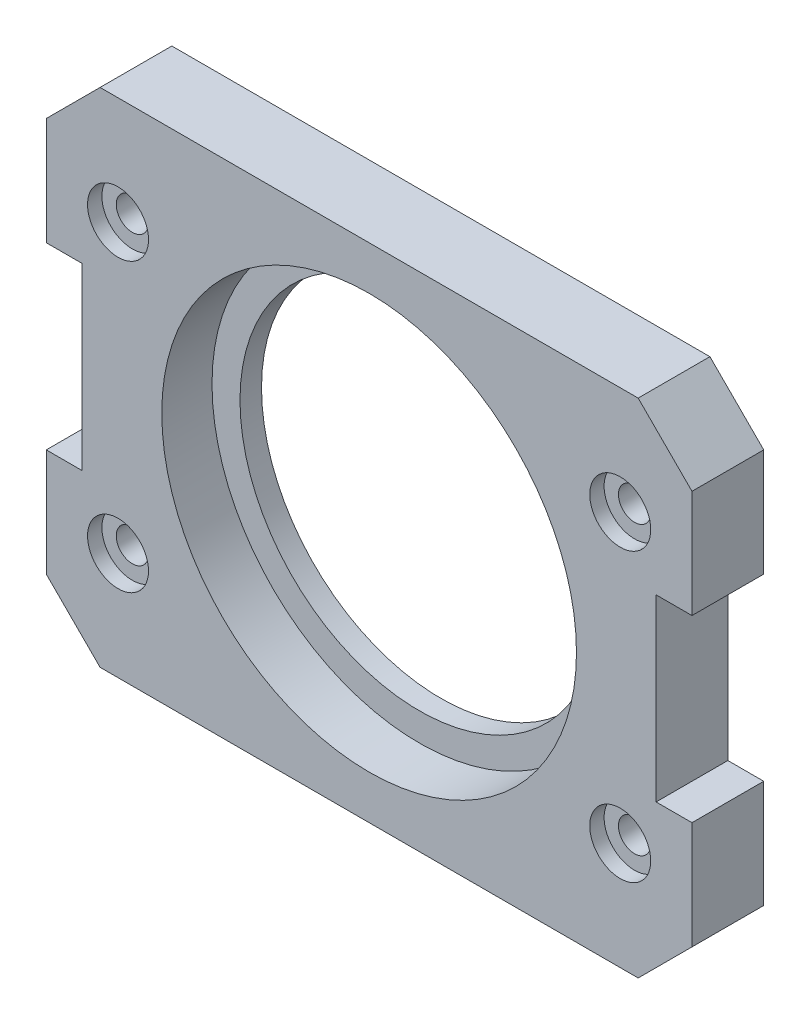
ISO-10303-21;
HEADER;
FILE_DESCRIPTION(('STEP AP214'),'2;1');
FILE_NAME('part.step','',(''),(''),'','','');
FILE_SCHEMA(('AUTOMOTIVE_DESIGN { 1 0 10303 214 1 1 1 1 }'));
ENDSEC;
DATA;
#1=APPLICATION_CONTEXT('core data for automotive mechanical design processes');
#2=APPLICATION_PROTOCOL_DEFINITION('international standard','automotive_design',2000,#1);
#3=PRODUCT_CONTEXT('',#1,'mechanical');
#4=PRODUCT('Part','Part','',(#3));
#5=PRODUCT_RELATED_PRODUCT_CATEGORY('part','',(#4));
#6=PRODUCT_DEFINITION_FORMATION('','',#4);
#7=PRODUCT_DEFINITION_CONTEXT('part definition',#1,'design');
#8=PRODUCT_DEFINITION('design','',#6,#7);
#9=PRODUCT_DEFINITION_SHAPE('','',#8);
#10=(LENGTH_UNIT() NAMED_UNIT(*) SI_UNIT(.MILLI.,.METRE.));
#11=(NAMED_UNIT(*) PLANE_ANGLE_UNIT() SI_UNIT($,.RADIAN.));
#12=(NAMED_UNIT(*) SI_UNIT($,.STERADIAN.) SOLID_ANGLE_UNIT());
#13=UNCERTAINTY_MEASURE_WITH_UNIT(LENGTH_MEASURE(1.E-05),#10,'distance_accuracy_value','');
#14=(GEOMETRIC_REPRESENTATION_CONTEXT(3) GLOBAL_UNCERTAINTY_ASSIGNED_CONTEXT((#13)) GLOBAL_UNIT_ASSIGNED_CONTEXT((#10,
#11,#12)) REPRESENTATION_CONTEXT('',''));
#15=CARTESIAN_POINT('',(0.,0.,0.));
#16=DIRECTION('',(0.,0.,1.));
#17=DIRECTION('',(1.,0.,0.));
#18=AXIS2_PLACEMENT_3D('',#15,#16,#17);
#19=CARTESIAN_POINT('',(45.,-35.,5.));
#20=DIRECTION('',(-1.,0.,0.));
#21=DIRECTION('',(0.,0.,1.));
#22=AXIS2_PLACEMENT_3D('',#19,#20,#21);
#23=PLANE('',#22);
#24=DIRECTION('',(0.,1.,0.));
#25=VECTOR('',#24,1.);
#26=CARTESIAN_POINT('',(45.,-35.,5.));
#27=LINE('',#26,#25);
#28=CARTESIAN_POINT('',(45.,-27.5,5.));
#29=VERTEX_POINT('',#28);
#30=CARTESIAN_POINT('',(45.,-12.5,5.));
#31=VERTEX_POINT('',#30);
#32=EDGE_CURVE('E269',#29,#31,#27,.T.);
#33=ORIENTED_EDGE('',*,*,#32,.F.);
#34=DIRECTION('',(0.,0.,-1.));
#35=VECTOR('',#34,1.);
#36=CARTESIAN_POINT('',(45.,-27.5,5.));
#37=LINE('',#36,#35);
#38=CARTESIAN_POINT('',(45.,-27.5,-5.));
#39=VERTEX_POINT('',#38);
#40=EDGE_CURVE('E332',#29,#39,#37,.T.);
#41=ORIENTED_EDGE('',*,*,#40,.T.);
#42=DIRECTION('',(0.,1.,0.));
#43=VECTOR('',#42,1.);
#44=CARTESIAN_POINT('',(45.,-35.,-5.));
#45=LINE('',#44,#43);
#46=CARTESIAN_POINT('',(45.,-12.5,-5.));
#47=VERTEX_POINT('',#46);
#48=EDGE_CURVE('E280',#39,#47,#45,.T.);
#49=ORIENTED_EDGE('',*,*,#48,.T.);
#50=DIRECTION('',(0.,0.,1.));
#51=VECTOR('',#50,1.);
#52=CARTESIAN_POINT('',(45.,-12.5,5.));
#53=LINE('',#52,#51);
#54=EDGE_CURVE('E307',#47,#31,#53,.T.);
#55=ORIENTED_EDGE('',*,*,#54,.T.);
#56=EDGE_LOOP('',(#33,#41,#49,#55));
#57=FACE_BOUND('',#56,.T.);
#58=ADVANCED_FACE('F43',(#57),#23,.F.);
#59=CARTESIAN_POINT('',(-45.,-35.,5.));
#60=DIRECTION('',(1.,0.,0.));
#61=DIRECTION('',(0.,0.,-1.));
#62=AXIS2_PLACEMENT_3D('',#59,#60,#61);
#63=PLANE('',#62);
#64=DIRECTION('',(0.,-1.,0.));
#65=VECTOR('',#64,1.);
#66=CARTESIAN_POINT('',(-45.,-35.,-5.));
#67=LINE('',#66,#65);
#68=CARTESIAN_POINT('',(-45.,-12.5,-5.));
#69=VERTEX_POINT('',#68);
#70=CARTESIAN_POINT('',(-45.,-27.5,-5.));
#71=VERTEX_POINT('',#70);
#72=EDGE_CURVE('E284',#69,#71,#67,.T.);
#73=ORIENTED_EDGE('',*,*,#72,.T.);
#74=DIRECTION('',(0.,0.,1.));
#75=VECTOR('',#74,1.);
#76=CARTESIAN_POINT('',(-45.,-27.5,5.));
#77=LINE('',#76,#75);
#78=CARTESIAN_POINT('',(-45.,-27.5,5.));
#79=VERTEX_POINT('',#78);
#80=EDGE_CURVE('E323',#71,#79,#77,.T.);
#81=ORIENTED_EDGE('',*,*,#80,.T.);
#82=DIRECTION('',(0.,-1.,0.));
#83=VECTOR('',#82,1.);
#84=CARTESIAN_POINT('',(-45.,-35.,5.));
#85=LINE('',#84,#83);
#86=CARTESIAN_POINT('',(-45.,-12.5,5.));
#87=VERTEX_POINT('',#86);
#88=EDGE_CURVE('E274',#87,#79,#85,.T.);
#89=ORIENTED_EDGE('',*,*,#88,.F.);
#90=DIRECTION('',(0.,0.,-1.));
#91=VECTOR('',#90,1.);
#92=CARTESIAN_POINT('',(-45.,-12.5,5.));
#93=LINE('',#92,#91);
#94=EDGE_CURVE('E301',#87,#69,#93,.T.);
#95=ORIENTED_EDGE('',*,*,#94,.T.);
#96=EDGE_LOOP('',(#73,#81,#89,#95));
#97=FACE_BOUND('',#96,.T.);
#98=ADVANCED_FACE('F366',(#97),#63,.F.);
#99=CARTESIAN_POINT('',(35.,20.,5.));
#100=DIRECTION('',(0.,0.,-1.));
#101=DIRECTION('',(-1.,0.,0.));
#102=AXIS2_PLACEMENT_3D('',#99,#100,#101);
#103=CYLINDRICAL_SURFACE('',#102,2.25);
#104=CARTESIAN_POINT('',(35.,20.,-5.));
#105=DIRECTION('',(0.,0.,1.));
#106=DIRECTION('',(1.,0.,0.));
#107=AXIS2_PLACEMENT_3D('',#104,#105,#106);
#108=CIRCLE('',#107,2.25);
#109=CARTESIAN_POINT('',(37.25,20.,-5.));
#110=VERTEX_POINT('',#109);
#111=EDGE_CURVE('E262',#110,#110,#108,.T.);
#112=ORIENTED_EDGE('',*,*,#111,.F.);
#113=EDGE_LOOP('',(#112));
#114=FACE_BOUND('',#113,.T.);
#115=CARTESIAN_POINT('',(35.,20.,3.));
#116=DIRECTION('',(0.,0.,1.));
#117=DIRECTION('',(1.,0.,0.));
#118=AXIS2_PLACEMENT_3D('',#115,#116,#117);
#119=CIRCLE('',#118,2.25);
#120=CARTESIAN_POINT('',(37.25,20.,3.));
#121=VERTEX_POINT('',#120);
#122=EDGE_CURVE('E250',#121,#121,#119,.T.);
#123=ORIENTED_EDGE('',*,*,#122,.T.);
#124=EDGE_LOOP('',(#123));
#125=FACE_BOUND('',#124,.T.);
#126=ADVANCED_FACE('F406',(#114,#125),#103,.F.);
#127=CARTESIAN_POINT('',(35.,-20.,5.));
#128=DIRECTION('',(0.,0.,-1.));
#129=DIRECTION('',(-1.,0.,0.));
#130=AXIS2_PLACEMENT_3D('',#127,#128,#129);
#131=CYLINDRICAL_SURFACE('',#130,2.25);
#132=CARTESIAN_POINT('',(35.,-20.,-5.));
#133=DIRECTION('',(0.,0.,1.));
#134=DIRECTION('',(1.,0.,0.));
#135=AXIS2_PLACEMENT_3D('',#132,#133,#134);
#136=CIRCLE('',#135,2.25);
#137=CARTESIAN_POINT('',(37.25,-20.,-5.));
#138=VERTEX_POINT('',#137);
#139=EDGE_CURVE('E259',#138,#138,#136,.T.);
#140=ORIENTED_EDGE('',*,*,#139,.F.);
#141=EDGE_LOOP('',(#140));
#142=FACE_BOUND('',#141,.T.);
#143=CARTESIAN_POINT('',(35.,-20.,3.));
#144=DIRECTION('',(0.,0.,1.));
#145=DIRECTION('',(1.,0.,0.));
#146=AXIS2_PLACEMENT_3D('',#143,#144,#145);
#147=CIRCLE('',#146,2.25);
#148=CARTESIAN_POINT('',(37.25,-20.,3.));
#149=VERTEX_POINT('',#148);
#150=EDGE_CURVE('E295',#149,#149,#147,.T.);
#151=ORIENTED_EDGE('',*,*,#150,.T.);
#152=EDGE_LOOP('',(#151));
#153=FACE_BOUND('',#152,.T.);
#154=ADVANCED_FACE('F592',(#142,#153),#131,.F.);
#155=CARTESIAN_POINT('',(-35.,-20.,5.));
#156=DIRECTION('',(0.,0.,-1.));
#157=DIRECTION('',(-1.,0.,0.));
#158=AXIS2_PLACEMENT_3D('',#155,#156,#157);
#159=CYLINDRICAL_SURFACE('',#158,2.25);
#160=CARTESIAN_POINT('',(-35.,-20.,-5.));
#161=DIRECTION('',(0.,0.,1.));
#162=DIRECTION('',(1.,0.,0.));
#163=AXIS2_PLACEMENT_3D('',#160,#161,#162);
#164=CIRCLE('',#163,2.25);
#165=CARTESIAN_POINT('',(-32.75,-20.,-5.));
#166=VERTEX_POINT('',#165);
#167=EDGE_CURVE('E256',#166,#166,#164,.T.);
#168=ORIENTED_EDGE('',*,*,#167,.F.);
#169=EDGE_LOOP('',(#168));
#170=FACE_BOUND('',#169,.T.);
#171=CARTESIAN_POINT('',(-35.,-20.,3.));
#172=DIRECTION('',(0.,0.,1.));
#173=DIRECTION('',(1.,0.,0.));
#174=AXIS2_PLACEMENT_3D('',#171,#172,#173);
#175=CIRCLE('',#174,2.25);
#176=CARTESIAN_POINT('',(-32.75,-20.,3.));
#177=VERTEX_POINT('',#176);
#178=EDGE_CURVE('E292',#177,#177,#175,.T.);
#179=ORIENTED_EDGE('',*,*,#178,.T.);
#180=EDGE_LOOP('',(#179));
#181=FACE_BOUND('',#180,.T.);
#182=ADVANCED_FACE('F603',(#170,#181),#159,.F.);
#183=CARTESIAN_POINT('',(-35.,20.,5.));
#184=DIRECTION('',(0.,0.,-1.));
#185=DIRECTION('',(-1.,0.,0.));
#186=AXIS2_PLACEMENT_3D('',#183,#184,#185);
#187=CYLINDRICAL_SURFACE('',#186,2.25);
#188=CARTESIAN_POINT('',(-35.,20.,-5.));
#189=DIRECTION('',(0.,0.,1.));
#190=DIRECTION('',(1.,0.,0.));
#191=AXIS2_PLACEMENT_3D('',#188,#189,#190);
#192=CIRCLE('',#191,2.25);
#193=CARTESIAN_POINT('',(-32.75,20.,-5.));
#194=VERTEX_POINT('',#193);
#195=EDGE_CURVE('E253',#194,#194,#192,.T.);
#196=ORIENTED_EDGE('',*,*,#195,.F.);
#197=EDGE_LOOP('',(#196));
#198=FACE_BOUND('',#197,.T.);
#199=CARTESIAN_POINT('',(-35.,20.,3.));
#200=DIRECTION('',(0.,0.,1.));
#201=DIRECTION('',(1.,0.,0.));
#202=AXIS2_PLACEMENT_3D('',#199,#200,#201);
#203=CIRCLE('',#202,2.25);
#204=CARTESIAN_POINT('',(-32.75,20.,3.));
#205=VERTEX_POINT('',#204);
#206=EDGE_CURVE('E240',#205,#205,#203,.T.);
#207=ORIENTED_EDGE('',*,*,#206,.T.);
#208=EDGE_LOOP('',(#207));
#209=FACE_BOUND('',#208,.T.);
#210=ADVANCED_FACE('F613',(#198,#209),#187,.F.);
#211=CARTESIAN_POINT('',(0.,0.,5.));
#212=DIRECTION('',(0.,0.,-1.));
#213=DIRECTION('',(-1.,0.,0.));
#214=AXIS2_PLACEMENT_3D('',#211,#212,#213);
#215=CYLINDRICAL_SURFACE('',#214,28.9);
#216=CARTESIAN_POINT('',(0.,0.,5.));
#217=DIRECTION('',(0.,0.,1.));
#218=DIRECTION('',(1.,0.,0.));
#219=AXIS2_PLACEMENT_3D('',#216,#217,#218);
#220=CIRCLE('',#219,28.9);
#221=CARTESIAN_POINT('',(28.9,0.,5.));
#222=VERTEX_POINT('',#221);
#223=EDGE_CURVE('E265',#222,#222,#220,.T.);
#224=ORIENTED_EDGE('',*,*,#223,.T.);
#225=EDGE_LOOP('',(#224));
#226=FACE_BOUND('',#225,.T.);
#227=CARTESIAN_POINT('',(0.,0.,-2.));
#228=DIRECTION('',(0.,0.,-1.));
#229=DIRECTION('',(-1.,0.,0.));
#230=AXIS2_PLACEMENT_3D('',#227,#228,#229);
#231=CIRCLE('',#230,28.9);
#232=CARTESIAN_POINT('',(-28.9,0.,-2.));
#233=VERTEX_POINT('',#232);
#234=EDGE_CURVE('E246',#233,#233,#231,.T.);
#235=ORIENTED_EDGE('',*,*,#234,.T.);
#236=EDGE_LOOP('',(#235));
#237=FACE_BOUND('',#236,.T.);
#238=ADVANCED_FACE('F419',(#226,#237),#215,.F.);
#239=CARTESIAN_POINT('',(0.,0.,5.));
#240=DIRECTION('',(0.,0.,-1.));
#241=DIRECTION('',(-1.,0.,0.));
#242=AXIS2_PLACEMENT_3D('',#239,#240,#241);
#243=PLANE('',#242);
#244=CARTESIAN_POINT('',(-35.,-20.,5.));
#245=DIRECTION('',(0.,0.,1.));
#246=DIRECTION('',(1.,0.,0.));
#247=AXIS2_PLACEMENT_3D('',#244,#245,#246);
#248=CIRCLE('',#247,4.25);
#249=CARTESIAN_POINT('',(-30.75,-20.,5.));
#250=VERTEX_POINT('',#249);
#251=EDGE_CURVE('E232',#250,#250,#248,.T.);
#252=ORIENTED_EDGE('',*,*,#251,.F.);
#253=EDGE_LOOP('',(#252));
#254=FACE_BOUND('',#253,.T.);
#255=CARTESIAN_POINT('',(35.,-20.,5.));
#256=DIRECTION('',(0.,0.,1.));
#257=DIRECTION('',(1.,0.,0.));
#258=AXIS2_PLACEMENT_3D('',#255,#256,#257);
#259=CIRCLE('',#258,4.25);
#260=CARTESIAN_POINT('',(39.25,-20.,5.));
#261=VERTEX_POINT('',#260);
#262=EDGE_CURVE('E226',#261,#261,#259,.T.);
#263=ORIENTED_EDGE('',*,*,#262,.F.);
#264=EDGE_LOOP('',(#263));
#265=FACE_BOUND('',#264,.T.);
#266=CARTESIAN_POINT('',(35.,20.,5.));
#267=DIRECTION('',(0.,0.,1.));
#268=DIRECTION('',(1.,0.,0.));
#269=AXIS2_PLACEMENT_3D('',#266,#267,#268);
#270=CIRCLE('',#269,4.25);
#271=CARTESIAN_POINT('',(39.25,20.,5.));
#272=VERTEX_POINT('',#271);
#273=EDGE_CURVE('E219',#272,#272,#270,.T.);
#274=ORIENTED_EDGE('',*,*,#273,.F.);
#275=EDGE_LOOP('',(#274));
#276=FACE_BOUND('',#275,.T.);
#277=CARTESIAN_POINT('',(-35.,20.,5.));
#278=DIRECTION('',(0.,0.,1.));
#279=DIRECTION('',(1.,0.,0.));
#280=AXIS2_PLACEMENT_3D('',#277,#278,#279);
#281=CIRCLE('',#280,4.25);
#282=CARTESIAN_POINT('',(-30.75,20.,5.));
#283=VERTEX_POINT('',#282);
#284=EDGE_CURVE('E222',#283,#283,#281,.T.);
#285=ORIENTED_EDGE('',*,*,#284,.F.);
#286=EDGE_LOOP('',(#285));
#287=FACE_BOUND('',#286,.T.);
#288=ORIENTED_EDGE('',*,*,#88,.T.);
#289=DIRECTION('',(-0.707106781186546,0.707106781186549,0.));
#290=VECTOR('',#289,1.);
#291=CARTESIAN_POINT('',(-37.5,-35.,5.));
#292=LINE('',#291,#290);
#293=CARTESIAN_POINT('',(-37.5,-35.,5.));
#294=VERTEX_POINT('',#293);
#295=EDGE_CURVE('E330',#79,#294,#292,.F.);
#296=ORIENTED_EDGE('',*,*,#295,.T.);
#297=DIRECTION('',(1.,0.,0.));
#298=VECTOR('',#297,1.);
#299=CARTESIAN_POINT('',(-45.,-35.,5.));
#300=LINE('',#299,#298);
#301=CARTESIAN_POINT('',(37.4999999999999,-35.,5.));
#302=VERTEX_POINT('',#301);
#303=EDGE_CURVE('E277',#294,#302,#300,.T.);
#304=ORIENTED_EDGE('',*,*,#303,.T.);
#305=DIRECTION('',(-0.707106781186549,-0.707106781186546,0.));
#306=VECTOR('',#305,1.);
#307=CARTESIAN_POINT('',(45.,-27.5,5.));
#308=LINE('',#307,#306);
#309=EDGE_CURVE('E328',#302,#29,#308,.F.);
#310=ORIENTED_EDGE('',*,*,#309,.T.);
#311=ORIENTED_EDGE('',*,*,#32,.T.);
#312=DIRECTION('',(1.,0.,0.));
#313=VECTOR('',#312,1.);
#314=CARTESIAN_POINT('',(50.,-12.5,5.));
#315=LINE('',#314,#313);
#316=CARTESIAN_POINT('',(40.,-12.5,5.));
#317=VERTEX_POINT('',#316);
#318=EDGE_CURVE('E204',#317,#31,#315,.T.);
#319=ORIENTED_EDGE('',*,*,#318,.F.);
#320=DIRECTION('',(0.,-1.,0.));
#321=VECTOR('',#320,1.);
#322=CARTESIAN_POINT('',(40.,-12.5,5.));
#323=LINE('',#322,#321);
#324=CARTESIAN_POINT('',(40.,12.5,5.));
#325=VERTEX_POINT('',#324);
#326=EDGE_CURVE('E207',#325,#317,#323,.T.);
#327=ORIENTED_EDGE('',*,*,#326,.F.);
#328=DIRECTION('',(-1.,0.,0.));
#329=VECTOR('',#328,1.);
#330=CARTESIAN_POINT('',(50.,12.5,5.));
#331=LINE('',#330,#329);
#332=CARTESIAN_POINT('',(45.,12.5,5.));
#333=VERTEX_POINT('',#332);
#334=EDGE_CURVE('E194',#333,#325,#331,.T.);
#335=ORIENTED_EDGE('',*,*,#334,.F.);
#336=CARTESIAN_POINT('',(45.,27.5,5.));
#337=VERTEX_POINT('',#336);
#338=EDGE_CURVE('E272',#333,#337,#27,.T.);
#339=ORIENTED_EDGE('',*,*,#338,.T.);
#340=DIRECTION('',(0.707106781186546,-0.707106781186549,0.));
#341=VECTOR('',#340,1.);
#342=CARTESIAN_POINT('',(37.5,35.,5.));
#343=LINE('',#342,#341);
#344=CARTESIAN_POINT('',(37.5,35.,5.));
#345=VERTEX_POINT('',#344);
#346=EDGE_CURVE('E326',#337,#345,#343,.F.);
#347=ORIENTED_EDGE('',*,*,#346,.T.);
#348=DIRECTION('',(-1.,0.,0.));
#349=VECTOR('',#348,1.);
#350=CARTESIAN_POINT('',(-45.,35.,5.));
#351=LINE('',#350,#349);
#352=CARTESIAN_POINT('',(-37.5,35.,5.));
#353=VERTEX_POINT('',#352);
#354=EDGE_CURVE('E271',#345,#353,#351,.T.);
#355=ORIENTED_EDGE('',*,*,#354,.T.);
#356=DIRECTION('',(0.707106781186549,0.707106781186546,0.));
#357=VECTOR('',#356,1.);
#358=CARTESIAN_POINT('',(-45.,27.5,5.));
#359=LINE('',#358,#357);
#360=CARTESIAN_POINT('',(-45.,27.5,5.));
#361=VERTEX_POINT('',#360);
#362=EDGE_CURVE('E59',#353,#361,#359,.F.);
#363=ORIENTED_EDGE('',*,*,#362,.T.);
#364=CARTESIAN_POINT('',(-45.,12.5,5.));
#365=VERTEX_POINT('',#364);
#366=EDGE_CURVE('E275',#361,#365,#85,.T.);
#367=ORIENTED_EDGE('',*,*,#366,.T.);
#368=DIRECTION('',(-1.,0.,0.));
#369=VECTOR('',#368,1.);
#370=CARTESIAN_POINT('',(-50.,12.5,5.));
#371=LINE('',#370,#369);
#372=CARTESIAN_POINT('',(-40.,12.5,5.));
#373=VERTEX_POINT('',#372);
#374=EDGE_CURVE('E189',#373,#365,#371,.T.);
#375=ORIENTED_EDGE('',*,*,#374,.F.);
#376=DIRECTION('',(0.,1.,0.));
#377=VECTOR('',#376,1.);
#378=CARTESIAN_POINT('',(-40.,-12.5,5.));
#379=LINE('',#378,#377);
#380=CARTESIAN_POINT('',(-40.,-12.5,5.));
#381=VERTEX_POINT('',#380);
#382=EDGE_CURVE('E167',#381,#373,#379,.T.);
#383=ORIENTED_EDGE('',*,*,#382,.F.);
#384=DIRECTION('',(1.,0.,0.));
#385=VECTOR('',#384,1.);
#386=CARTESIAN_POINT('',(-50.,-12.5,5.));
#387=LINE('',#386,#385);
#388=EDGE_CURVE('E187',#87,#381,#387,.T.);
#389=ORIENTED_EDGE('',*,*,#388,.F.);
#390=EDGE_LOOP('',(#288,#296,#304,#310,#311,#319,#327,#335,#339,#347,#355,#363,#367,#375,#383,#389));
#391=FACE_BOUND('',#390,.T.);
#392=ORIENTED_EDGE('',*,*,#223,.F.);
#393=EDGE_LOOP('',(#392));
#394=FACE_BOUND('',#393,.T.);
#395=ADVANCED_FACE('F349',(#254,#265,#276,#287,#391,#394),#243,.F.);
#396=CARTESIAN_POINT('',(0.,0.,-5.));
#397=DIRECTION('',(0.,0.,-1.));
#398=DIRECTION('',(-1.,0.,0.));
#399=AXIS2_PLACEMENT_3D('',#396,#397,#398);
#400=PLANE('',#399);
#401=DIRECTION('',(1.,0.,0.));
#402=VECTOR('',#401,1.);
#403=CARTESIAN_POINT('',(-45.,-35.,-5.));
#404=LINE('',#403,#402);
#405=CARTESIAN_POINT('',(-37.5,-35.,-5.));
#406=VERTEX_POINT('',#405);
#407=CARTESIAN_POINT('',(37.4999999999999,-35.,-5.));
#408=VERTEX_POINT('',#407);
#409=EDGE_CURVE('E287',#406,#408,#404,.T.);
#410=ORIENTED_EDGE('',*,*,#409,.F.);
#411=DIRECTION('',(0.707106781186546,-0.707106781186549,0.));
#412=VECTOR('',#411,1.);
#413=CARTESIAN_POINT('',(-36.2500000000001,-36.2499999999999,-5.));
#414=LINE('',#413,#412);
#415=EDGE_CURVE('E321',#406,#71,#414,.F.);
#416=ORIENTED_EDGE('',*,*,#415,.T.);
#417=ORIENTED_EDGE('',*,*,#72,.F.);
#418=DIRECTION('',(1.,0.,0.));
#419=VECTOR('',#418,1.);
#420=CARTESIAN_POINT('',(-50.,-12.5,-5.));
#421=LINE('',#420,#419);
#422=CARTESIAN_POINT('',(-40.,-12.5,-5.));
#423=VERTEX_POINT('',#422);
#424=EDGE_CURVE('E172',#69,#423,#421,.T.);
#425=ORIENTED_EDGE('',*,*,#424,.T.);
#426=DIRECTION('',(0.,1.,0.));
#427=VECTOR('',#426,1.);
#428=CARTESIAN_POINT('',(-40.,-12.5,-5.));
#429=LINE('',#428,#427);
#430=CARTESIAN_POINT('',(-40.,12.5,-5.));
#431=VERTEX_POINT('',#430);
#432=EDGE_CURVE('E164',#423,#431,#429,.T.);
#433=ORIENTED_EDGE('',*,*,#432,.T.);
#434=DIRECTION('',(-1.,0.,0.));
#435=VECTOR('',#434,1.);
#436=CARTESIAN_POINT('',(-50.,12.5,-5.));
#437=LINE('',#436,#435);
#438=CARTESIAN_POINT('',(-45.,12.5,-5.));
#439=VERTEX_POINT('',#438);
#440=EDGE_CURVE('E176',#431,#439,#437,.T.);
#441=ORIENTED_EDGE('',*,*,#440,.T.);
#442=CARTESIAN_POINT('',(-45.,27.5,-5.));
#443=VERTEX_POINT('',#442);
#444=EDGE_CURVE('E285',#443,#439,#67,.T.);
#445=ORIENTED_EDGE('',*,*,#444,.F.);
#446=DIRECTION('',(-0.707106781186549,-0.707106781186546,0.));
#447=VECTOR('',#446,1.);
#448=CARTESIAN_POINT('',(-36.2499999999999,36.25,-5.));
#449=LINE('',#448,#447);
#450=CARTESIAN_POINT('',(-37.5,35.,-5.));
#451=VERTEX_POINT('',#450);
#452=EDGE_CURVE('E315',#443,#451,#449,.F.);
#453=ORIENTED_EDGE('',*,*,#452,.T.);
#454=DIRECTION('',(-1.,0.,0.));
#455=VECTOR('',#454,1.);
#456=CARTESIAN_POINT('',(-45.,35.,-5.));
#457=LINE('',#456,#455);
#458=CARTESIAN_POINT('',(37.5,35.,-5.));
#459=VERTEX_POINT('',#458);
#460=EDGE_CURVE('E282',#459,#451,#457,.T.);
#461=ORIENTED_EDGE('',*,*,#460,.F.);
#462=DIRECTION('',(-0.707106781186546,0.707106781186549,0.));
#463=VECTOR('',#462,1.);
#464=CARTESIAN_POINT('',(36.2500000000001,36.2499999999999,-5.));
#465=LINE('',#464,#463);
#466=CARTESIAN_POINT('',(45.,27.5,-5.));
#467=VERTEX_POINT('',#466);
#468=EDGE_CURVE('E317',#459,#467,#465,.F.);
#469=ORIENTED_EDGE('',*,*,#468,.T.);
#470=CARTESIAN_POINT('',(45.,12.5,-5.));
#471=VERTEX_POINT('',#470);
#472=EDGE_CURVE('E268',#471,#467,#45,.T.);
#473=ORIENTED_EDGE('',*,*,#472,.F.);
#474=DIRECTION('',(-1.,0.,0.));
#475=VECTOR('',#474,1.);
#476=CARTESIAN_POINT('',(50.,12.5,-5.));
#477=LINE('',#476,#475);
#478=CARTESIAN_POINT('',(40.,12.5,-5.));
#479=VERTEX_POINT('',#478);
#480=EDGE_CURVE('E208',#471,#479,#477,.T.);
#481=ORIENTED_EDGE('',*,*,#480,.T.);
#482=DIRECTION('',(0.,-1.,0.));
#483=VECTOR('',#482,1.);
#484=CARTESIAN_POINT('',(40.,-12.5,-5.));
#485=LINE('',#484,#483);
#486=CARTESIAN_POINT('',(40.,-12.5,-5.));
#487=VERTEX_POINT('',#486);
#488=EDGE_CURVE('E214',#479,#487,#485,.T.);
#489=ORIENTED_EDGE('',*,*,#488,.T.);
#490=DIRECTION('',(1.,0.,0.));
#491=VECTOR('',#490,1.);
#492=CARTESIAN_POINT('',(50.,-12.5,-5.));
#493=LINE('',#492,#491);
#494=EDGE_CURVE('E201',#487,#47,#493,.T.);
#495=ORIENTED_EDGE('',*,*,#494,.T.);
#496=ORIENTED_EDGE('',*,*,#48,.F.);
#497=DIRECTION('',(0.707106781186549,0.707106781186546,0.));
#498=VECTOR('',#497,1.);
#499=CARTESIAN_POINT('',(36.2499999999999,-36.25,-5.));
#500=LINE('',#499,#498);
#501=EDGE_CURVE('E319',#39,#408,#500,.F.);
#502=ORIENTED_EDGE('',*,*,#501,.T.);
#503=EDGE_LOOP('',(#410,#416,#417,#425,#433,#441,#445,#453,#461,#469,#473,#481,#489,#495,#496,#502));
#504=FACE_BOUND('',#503,.T.);
#505=ORIENTED_EDGE('',*,*,#167,.T.);
#506=EDGE_LOOP('',(#505));
#507=FACE_BOUND('',#506,.T.);
#508=ORIENTED_EDGE('',*,*,#111,.T.);
#509=EDGE_LOOP('',(#508));
#510=FACE_BOUND('',#509,.T.);
#511=ORIENTED_EDGE('',*,*,#139,.T.);
#512=EDGE_LOOP('',(#511));
#513=FACE_BOUND('',#512,.T.);
#514=ORIENTED_EDGE('',*,*,#195,.T.);
#515=EDGE_LOOP('',(#514));
#516=FACE_BOUND('',#515,.T.);
#517=CARTESIAN_POINT('',(0.,0.,-5.));
#518=DIRECTION('',(0.,0.,-1.));
#519=DIRECTION('',(-1.,0.,0.));
#520=AXIS2_PLACEMENT_3D('',#517,#518,#519);
#521=CIRCLE('',#520,25.);
#522=CARTESIAN_POINT('',(-25.,0.,-5.));
#523=VERTEX_POINT('',#522);
#524=EDGE_CURVE('E247',#523,#523,#521,.T.);
#525=ORIENTED_EDGE('',*,*,#524,.F.);
#526=EDGE_LOOP('',(#525));
#527=FACE_BOUND('',#526,.T.);
#528=ADVANCED_FACE('F184',(#504,#507,#510,#513,#516,#527),#400,.T.);
#529=ORIENTED_EDGE('',*,*,#472,.T.);
#530=DIRECTION('',(0.,0.,1.));
#531=VECTOR('',#530,1.);
#532=CARTESIAN_POINT('',(45.,27.5,5.));
#533=LINE('',#532,#531);
#534=EDGE_CURVE('E52',#467,#337,#533,.T.);
#535=ORIENTED_EDGE('',*,*,#534,.T.);
#536=ORIENTED_EDGE('',*,*,#338,.F.);
#537=DIRECTION('',(0.,0.,-1.));
#538=VECTOR('',#537,1.);
#539=CARTESIAN_POINT('',(45.,12.5,5.));
#540=LINE('',#539,#538);
#541=EDGE_CURVE('E304',#333,#471,#540,.T.);
#542=ORIENTED_EDGE('',*,*,#541,.T.);
#543=EDGE_LOOP('',(#529,#535,#536,#542));
#544=FACE_BOUND('',#543,.T.);
#545=ADVANCED_FACE('F343',(#544),#23,.F.);
#546=CARTESIAN_POINT('',(-45.,35.,5.));
#547=DIRECTION('',(0.,-1.,0.));
#548=DIRECTION('',(0.,0.,-1.));
#549=AXIS2_PLACEMENT_3D('',#546,#547,#548);
#550=PLANE('',#549);
#551=ORIENTED_EDGE('',*,*,#354,.F.);
#552=DIRECTION('',(0.,0.,-1.));
#553=VECTOR('',#552,1.);
#554=CARTESIAN_POINT('',(37.5,35.,5.));
#555=LINE('',#554,#553);
#556=EDGE_CURVE('E336',#345,#459,#555,.T.);
#557=ORIENTED_EDGE('',*,*,#556,.T.);
#558=ORIENTED_EDGE('',*,*,#460,.T.);
#559=DIRECTION('',(0.,0.,1.));
#560=VECTOR('',#559,1.);
#561=CARTESIAN_POINT('',(-37.5,35.,5.));
#562=LINE('',#561,#560);
#563=EDGE_CURVE('E67',#451,#353,#562,.T.);
#564=ORIENTED_EDGE('',*,*,#563,.T.);
#565=EDGE_LOOP('',(#551,#557,#558,#564));
#566=FACE_BOUND('',#565,.T.);
#567=ADVANCED_FACE('F355',(#566),#550,.F.);
#568=ORIENTED_EDGE('',*,*,#366,.F.);
#569=DIRECTION('',(0.,0.,-1.));
#570=VECTOR('',#569,1.);
#571=CARTESIAN_POINT('',(-45.,27.5,5.));
#572=LINE('',#571,#570);
#573=EDGE_CURVE('E11',#361,#443,#572,.T.);
#574=ORIENTED_EDGE('',*,*,#573,.T.);
#575=ORIENTED_EDGE('',*,*,#444,.T.);
#576=DIRECTION('',(0.,0.,1.));
#577=VECTOR('',#576,1.);
#578=CARTESIAN_POINT('',(-45.,12.5,5.));
#579=LINE('',#578,#577);
#580=EDGE_CURVE('E179',#439,#365,#579,.T.);
#581=ORIENTED_EDGE('',*,*,#580,.T.);
#582=EDGE_LOOP('',(#568,#574,#575,#581));
#583=FACE_BOUND('',#582,.T.);
#584=ADVANCED_FACE('F359',(#583),#63,.F.);
#585=CARTESIAN_POINT('',(-45.,-35.,5.));
#586=DIRECTION('',(0.,1.,0.));
#587=DIRECTION('',(0.,0.,1.));
#588=AXIS2_PLACEMENT_3D('',#585,#586,#587);
#589=PLANE('',#588);
#590=ORIENTED_EDGE('',*,*,#303,.F.);
#591=DIRECTION('',(0.,0.,-1.));
#592=VECTOR('',#591,1.);
#593=CARTESIAN_POINT('',(-37.5,-35.,5.));
#594=LINE('',#593,#592);
#595=EDGE_CURVE('E312',#294,#406,#594,.T.);
#596=ORIENTED_EDGE('',*,*,#595,.T.);
#597=ORIENTED_EDGE('',*,*,#409,.T.);
#598=DIRECTION('',(0.,0.,1.));
#599=VECTOR('',#598,1.);
#600=CARTESIAN_POINT('',(37.5,-35.,5.));
#601=LINE('',#600,#599);
#602=EDGE_CURVE('E310',#408,#302,#601,.T.);
#603=ORIENTED_EDGE('',*,*,#602,.T.);
#604=EDGE_LOOP('',(#590,#596,#597,#603));
#605=FACE_BOUND('',#604,.T.);
#606=ADVANCED_FACE('F374',(#605),#589,.F.);
#607=CARTESIAN_POINT('',(0.,0.,-2.));
#608=DIRECTION('',(0.,0.,-1.));
#609=DIRECTION('',(-1.,0.,0.));
#610=AXIS2_PLACEMENT_3D('',#607,#608,#609);
#611=PLANE('',#610);
#612=CARTESIAN_POINT('',(0.,0.,-2.));
#613=DIRECTION('',(0.,0.,-1.));
#614=DIRECTION('',(-1.,0.,0.));
#615=AXIS2_PLACEMENT_3D('',#612,#613,#614);
#616=CIRCLE('',#615,25.);
#617=CARTESIAN_POINT('',(-25.,0.,-2.));
#618=VERTEX_POINT('',#617);
#619=EDGE_CURVE('E243',#618,#618,#616,.T.);
#620=ORIENTED_EDGE('',*,*,#619,.T.);
#621=EDGE_LOOP('',(#620));
#622=FACE_BOUND('',#621,.T.);
#623=ORIENTED_EDGE('',*,*,#234,.F.);
#624=EDGE_LOOP('',(#623));
#625=FACE_BOUND('',#624,.T.);
#626=ADVANCED_FACE('F425',(#622,#625),#611,.F.);
#627=CARTESIAN_POINT('',(0.,0.,-2.));
#628=DIRECTION('',(0.,0.,-1.));
#629=DIRECTION('',(-1.,0.,0.));
#630=AXIS2_PLACEMENT_3D('',#627,#628,#629);
#631=CYLINDRICAL_SURFACE('',#630,25.);
#632=ORIENTED_EDGE('',*,*,#619,.F.);
#633=EDGE_LOOP('',(#632));
#634=FACE_BOUND('',#633,.T.);
#635=ORIENTED_EDGE('',*,*,#524,.T.);
#636=EDGE_LOOP('',(#635));
#637=FACE_BOUND('',#636,.T.);
#638=ADVANCED_FACE('F583',(#634,#637),#631,.F.);
#639=CARTESIAN_POINT('',(-35.,20.,3.));
#640=DIRECTION('',(0.,0.,1.));
#641=DIRECTION('',(1.,0.,0.));
#642=AXIS2_PLACEMENT_3D('',#639,#640,#641);
#643=CYLINDRICAL_SURFACE('',#642,4.25);
#644=CARTESIAN_POINT('',(-35.,20.,3.));
#645=DIRECTION('',(0.,0.,1.));
#646=DIRECTION('',(1.,0.,0.));
#647=AXIS2_PLACEMENT_3D('',#644,#645,#646);
#648=CIRCLE('',#647,4.25);
#649=CARTESIAN_POINT('',(-30.75,20.,3.));
#650=VERTEX_POINT('',#649);
#651=EDGE_CURVE('E237',#650,#650,#648,.T.);
#652=ORIENTED_EDGE('',*,*,#651,.F.);
#653=EDGE_LOOP('',(#652));
#654=FACE_BOUND('',#653,.T.);
#655=ORIENTED_EDGE('',*,*,#284,.T.);
#656=EDGE_LOOP('',(#655));
#657=FACE_BOUND('',#656,.T.);
#658=ADVANCED_FACE('F574',(#654,#657),#643,.F.);
#659=CARTESIAN_POINT('',(-35.,20.,3.));
#660=DIRECTION('',(0.,0.,1.));
#661=DIRECTION('',(1.,0.,0.));
#662=AXIS2_PLACEMENT_3D('',#659,#660,#661);
#663=PLANE('',#662);
#664=ORIENTED_EDGE('',*,*,#206,.F.);
#665=EDGE_LOOP('',(#664));
#666=FACE_BOUND('',#665,.T.);
#667=ORIENTED_EDGE('',*,*,#651,.T.);
#668=EDGE_LOOP('',(#667));
#669=FACE_BOUND('',#668,.T.);
#670=ADVANCED_FACE('F565',(#666,#669),#663,.T.);
#671=CARTESIAN_POINT('',(-35.,-20.,3.));
#672=DIRECTION('',(0.,0.,1.));
#673=DIRECTION('',(1.,0.,0.));
#674=AXIS2_PLACEMENT_3D('',#671,#672,#673);
#675=CYLINDRICAL_SURFACE('',#674,4.25);
#676=CARTESIAN_POINT('',(-35.,-20.,3.));
#677=DIRECTION('',(0.,0.,1.));
#678=DIRECTION('',(1.,0.,0.));
#679=AXIS2_PLACEMENT_3D('',#676,#677,#678);
#680=CIRCLE('',#679,4.25);
#681=CARTESIAN_POINT('',(-30.75,-20.,3.));
#682=VERTEX_POINT('',#681);
#683=EDGE_CURVE('E196',#682,#682,#680,.T.);
#684=ORIENTED_EDGE('',*,*,#683,.F.);
#685=EDGE_LOOP('',(#684));
#686=FACE_BOUND('',#685,.T.);
#687=ORIENTED_EDGE('',*,*,#251,.T.);
#688=EDGE_LOOP('',(#687));
#689=FACE_BOUND('',#688,.T.);
#690=ADVANCED_FACE('F556',(#686,#689),#675,.F.);
#691=CARTESIAN_POINT('',(-35.,-20.,3.));
#692=DIRECTION('',(0.,0.,1.));
#693=DIRECTION('',(1.,0.,0.));
#694=AXIS2_PLACEMENT_3D('',#691,#692,#693);
#695=PLANE('',#694);
#696=ORIENTED_EDGE('',*,*,#178,.F.);
#697=EDGE_LOOP('',(#696));
#698=FACE_BOUND('',#697,.T.);
#699=ORIENTED_EDGE('',*,*,#683,.T.);
#700=EDGE_LOOP('',(#699));
#701=FACE_BOUND('',#700,.T.);
#702=ADVANCED_FACE('F547',(#698,#701),#695,.T.);
#703=CARTESIAN_POINT('',(35.,-20.,3.));
#704=DIRECTION('',(0.,0.,1.));
#705=DIRECTION('',(1.,0.,0.));
#706=AXIS2_PLACEMENT_3D('',#703,#704,#705);
#707=CYLINDRICAL_SURFACE('',#706,4.25);
#708=CARTESIAN_POINT('',(35.,-20.,3.));
#709=DIRECTION('',(0.,0.,1.));
#710=DIRECTION('',(1.,0.,0.));
#711=AXIS2_PLACEMENT_3D('',#708,#709,#710);
#712=CIRCLE('',#711,4.25);
#713=CARTESIAN_POINT('',(39.25,-20.,3.));
#714=VERTEX_POINT('',#713);
#715=EDGE_CURVE('E229',#714,#714,#712,.T.);
#716=ORIENTED_EDGE('',*,*,#715,.F.);
#717=EDGE_LOOP('',(#716));
#718=FACE_BOUND('',#717,.T.);
#719=ORIENTED_EDGE('',*,*,#262,.T.);
#720=EDGE_LOOP('',(#719));
#721=FACE_BOUND('',#720,.T.);
#722=ADVANCED_FACE('F538',(#718,#721),#707,.F.);
#723=CARTESIAN_POINT('',(35.,-20.,3.));
#724=DIRECTION('',(0.,0.,1.));
#725=DIRECTION('',(1.,0.,0.));
#726=AXIS2_PLACEMENT_3D('',#723,#724,#725);
#727=PLANE('',#726);
#728=ORIENTED_EDGE('',*,*,#150,.F.);
#729=EDGE_LOOP('',(#728));
#730=FACE_BOUND('',#729,.T.);
#731=ORIENTED_EDGE('',*,*,#715,.T.);
#732=EDGE_LOOP('',(#731));
#733=FACE_BOUND('',#732,.T.);
#734=ADVANCED_FACE('F529',(#730,#733),#727,.T.);
#735=CARTESIAN_POINT('',(35.,20.,3.));
#736=DIRECTION('',(0.,0.,1.));
#737=DIRECTION('',(1.,0.,0.));
#738=AXIS2_PLACEMENT_3D('',#735,#736,#737);
#739=CYLINDRICAL_SURFACE('',#738,4.25);
#740=CARTESIAN_POINT('',(35.,20.,3.));
#741=DIRECTION('',(0.,0.,1.));
#742=DIRECTION('',(1.,0.,0.));
#743=AXIS2_PLACEMENT_3D('',#740,#741,#742);
#744=CIRCLE('',#743,4.25);
#745=CARTESIAN_POINT('',(39.25,20.,3.));
#746=VERTEX_POINT('',#745);
#747=EDGE_CURVE('E223',#746,#746,#744,.T.);
#748=ORIENTED_EDGE('',*,*,#747,.F.);
#749=EDGE_LOOP('',(#748));
#750=FACE_BOUND('',#749,.T.);
#751=ORIENTED_EDGE('',*,*,#273,.T.);
#752=EDGE_LOOP('',(#751));
#753=FACE_BOUND('',#752,.T.);
#754=ADVANCED_FACE('F520',(#750,#753),#739,.F.);
#755=CARTESIAN_POINT('',(35.,20.,3.));
#756=DIRECTION('',(0.,0.,1.));
#757=DIRECTION('',(1.,0.,0.));
#758=AXIS2_PLACEMENT_3D('',#755,#756,#757);
#759=PLANE('',#758);
#760=ORIENTED_EDGE('',*,*,#122,.F.);
#761=EDGE_LOOP('',(#760));
#762=FACE_BOUND('',#761,.T.);
#763=ORIENTED_EDGE('',*,*,#747,.T.);
#764=EDGE_LOOP('',(#763));
#765=FACE_BOUND('',#764,.T.);
#766=ADVANCED_FACE('F501',(#762,#765),#759,.T.);
#767=CARTESIAN_POINT('',(-50.,-12.5,-5.));
#768=DIRECTION('',(0.,-1.,0.));
#769=DIRECTION('',(0.,0.,-1.));
#770=AXIS2_PLACEMENT_3D('',#767,#768,#769);
#771=PLANE('',#770);
#772=ORIENTED_EDGE('',*,*,#388,.T.);
#773=DIRECTION('',(0.,0.,1.));
#774=VECTOR('',#773,1.);
#775=CARTESIAN_POINT('',(-40.,-12.5,-5.));
#776=LINE('',#775,#774);
#777=EDGE_CURVE('E171',#423,#381,#776,.T.);
#778=ORIENTED_EDGE('',*,*,#777,.F.);
#779=ORIENTED_EDGE('',*,*,#424,.F.);
#780=ORIENTED_EDGE('',*,*,#94,.F.);
#781=EDGE_LOOP('',(#772,#778,#779,#780));
#782=FACE_BOUND('',#781,.T.);
#783=ADVANCED_FACE('F494',(#782),#771,.F.);
#784=CARTESIAN_POINT('',(-50.,12.5,-5.));
#785=DIRECTION('',(0.,1.,0.));
#786=DIRECTION('',(0.,0.,1.));
#787=AXIS2_PLACEMENT_3D('',#784,#785,#786);
#788=PLANE('',#787);
#789=ORIENTED_EDGE('',*,*,#440,.F.);
#790=DIRECTION('',(0.,0.,1.));
#791=VECTOR('',#790,1.);
#792=CARTESIAN_POINT('',(-40.,12.5,-5.));
#793=LINE('',#792,#791);
#794=EDGE_CURVE('E159',#431,#373,#793,.T.);
#795=ORIENTED_EDGE('',*,*,#794,.T.);
#796=ORIENTED_EDGE('',*,*,#374,.T.);
#797=ORIENTED_EDGE('',*,*,#580,.F.);
#798=EDGE_LOOP('',(#789,#795,#796,#797));
#799=FACE_BOUND('',#798,.T.);
#800=ADVANCED_FACE('F177',(#799),#788,.F.);
#801=CARTESIAN_POINT('',(-40.,-12.5,-5.));
#802=DIRECTION('',(1.,0.,0.));
#803=DIRECTION('',(0.,0.,-1.));
#804=AXIS2_PLACEMENT_3D('',#801,#802,#803);
#805=PLANE('',#804);
#806=ORIENTED_EDGE('',*,*,#382,.T.);
#807=ORIENTED_EDGE('',*,*,#794,.F.);
#808=ORIENTED_EDGE('',*,*,#432,.F.);
#809=ORIENTED_EDGE('',*,*,#777,.T.);
#810=EDGE_LOOP('',(#806,#807,#808,#809));
#811=FACE_BOUND('',#810,.T.);
#812=ADVANCED_FACE('F161',(#811),#805,.F.);
#813=CARTESIAN_POINT('',(50.,-12.5,-5.));
#814=DIRECTION('',(0.,-1.,0.));
#815=DIRECTION('',(0.,0.,-1.));
#816=AXIS2_PLACEMENT_3D('',#813,#814,#815);
#817=PLANE('',#816);
#818=ORIENTED_EDGE('',*,*,#494,.F.);
#819=DIRECTION('',(0.,0.,1.));
#820=VECTOR('',#819,1.);
#821=CARTESIAN_POINT('',(40.,-12.5,-5.));
#822=LINE('',#821,#820);
#823=EDGE_CURVE('E202',#487,#317,#822,.T.);
#824=ORIENTED_EDGE('',*,*,#823,.T.);
#825=ORIENTED_EDGE('',*,*,#318,.T.);
#826=ORIENTED_EDGE('',*,*,#54,.F.);
#827=EDGE_LOOP('',(#818,#824,#825,#826));
#828=FACE_BOUND('',#827,.T.);
#829=ADVANCED_FACE('F386',(#828),#817,.F.);
#830=CARTESIAN_POINT('',(50.,12.5,-5.));
#831=DIRECTION('',(0.,1.,0.));
#832=DIRECTION('',(0.,0.,1.));
#833=AXIS2_PLACEMENT_3D('',#830,#831,#832);
#834=PLANE('',#833);
#835=ORIENTED_EDGE('',*,*,#334,.T.);
#836=DIRECTION('',(0.,0.,1.));
#837=VECTOR('',#836,1.);
#838=CARTESIAN_POINT('',(40.,12.5,-5.));
#839=LINE('',#838,#837);
#840=EDGE_CURVE('E198',#479,#325,#839,.T.);
#841=ORIENTED_EDGE('',*,*,#840,.F.);
#842=ORIENTED_EDGE('',*,*,#480,.F.);
#843=ORIENTED_EDGE('',*,*,#541,.F.);
#844=EDGE_LOOP('',(#835,#841,#842,#843));
#845=FACE_BOUND('',#844,.T.);
#846=ADVANCED_FACE('F391',(#845),#834,.F.);
#847=CARTESIAN_POINT('',(40.,-12.5,-5.));
#848=DIRECTION('',(-1.,0.,0.));
#849=DIRECTION('',(0.,0.,1.));
#850=AXIS2_PLACEMENT_3D('',#847,#848,#849);
#851=PLANE('',#850);
#852=ORIENTED_EDGE('',*,*,#326,.T.);
#853=ORIENTED_EDGE('',*,*,#823,.F.);
#854=ORIENTED_EDGE('',*,*,#488,.F.);
#855=ORIENTED_EDGE('',*,*,#840,.T.);
#856=EDGE_LOOP('',(#852,#853,#854,#855));
#857=FACE_BOUND('',#856,.T.);
#858=ADVANCED_FACE('F389',(#857),#851,.F.);
#859=CARTESIAN_POINT('',(-37.5,-35.,5.));
#860=DIRECTION('',(0.707106781186549,0.707106781186546,0.));
#861=DIRECTION('',(0.,0.,-1.));
#862=AXIS2_PLACEMENT_3D('',#859,#860,#861);
#863=PLANE('',#862);
#864=ORIENTED_EDGE('',*,*,#295,.F.);
#865=ORIENTED_EDGE('',*,*,#80,.F.);
#866=ORIENTED_EDGE('',*,*,#415,.F.);
#867=ORIENTED_EDGE('',*,*,#595,.F.);
#868=EDGE_LOOP('',(#864,#865,#866,#867));
#869=FACE_BOUND('',#868,.T.);
#870=ADVANCED_FACE('F369',(#869),#863,.F.);
#871=CARTESIAN_POINT('',(45.,-27.5,5.));
#872=DIRECTION('',(-0.707106781186546,0.707106781186549,0.));
#873=DIRECTION('',(0.,0.,-1.));
#874=AXIS2_PLACEMENT_3D('',#871,#872,#873);
#875=PLANE('',#874);
#876=ORIENTED_EDGE('',*,*,#309,.F.);
#877=ORIENTED_EDGE('',*,*,#602,.F.);
#878=ORIENTED_EDGE('',*,*,#501,.F.);
#879=ORIENTED_EDGE('',*,*,#40,.F.);
#880=EDGE_LOOP('',(#876,#877,#878,#879));
#881=FACE_BOUND('',#880,.T.);
#882=ADVANCED_FACE('F377',(#881),#875,.F.);
#883=CARTESIAN_POINT('',(37.5,35.,5.));
#884=DIRECTION('',(-0.707106781186549,-0.707106781186546,0.));
#885=DIRECTION('',(0.,0.,-1.));
#886=AXIS2_PLACEMENT_3D('',#883,#884,#885);
#887=PLANE('',#886);
#888=ORIENTED_EDGE('',*,*,#346,.F.);
#889=ORIENTED_EDGE('',*,*,#534,.F.);
#890=ORIENTED_EDGE('',*,*,#468,.F.);
#891=ORIENTED_EDGE('',*,*,#556,.F.);
#892=EDGE_LOOP('',(#888,#889,#890,#891));
#893=FACE_BOUND('',#892,.T.);
#894=ADVANCED_FACE('F353',(#893),#887,.F.);
#895=CARTESIAN_POINT('',(-45.,27.5,5.));
#896=DIRECTION('',(0.707106781186546,-0.707106781186549,0.));
#897=DIRECTION('',(0.,0.,-1.));
#898=AXIS2_PLACEMENT_3D('',#895,#896,#897);
#899=PLANE('',#898);
#900=ORIENTED_EDGE('',*,*,#362,.F.);
#901=ORIENTED_EDGE('',*,*,#563,.F.);
#902=ORIENTED_EDGE('',*,*,#452,.F.);
#903=ORIENTED_EDGE('',*,*,#573,.F.);
#904=EDGE_LOOP('',(#900,#901,#902,#903));
#905=FACE_BOUND('',#904,.T.);
#906=ADVANCED_FACE('F46',(#905),#899,.F.);
#907=CLOSED_SHELL('',(#58,#98,#126,#154,#182,#210,#238,#395,#528,#545,#567,#584,#606,#626,#638,
#658,#670,#690,#702,#722,#734,#754,#766,#783,#800,#812,#829,#846,#858,#870,#882,#894,#906));
#908=MANIFOLD_SOLID_BREP('B2',#907);
#909=ADVANCED_BREP_SHAPE_REPRESENTATION('',(#18,#908),#14);
#910=SHAPE_DEFINITION_REPRESENTATION(#9,#909);
ENDSEC;
END-ISO-10303-21;
